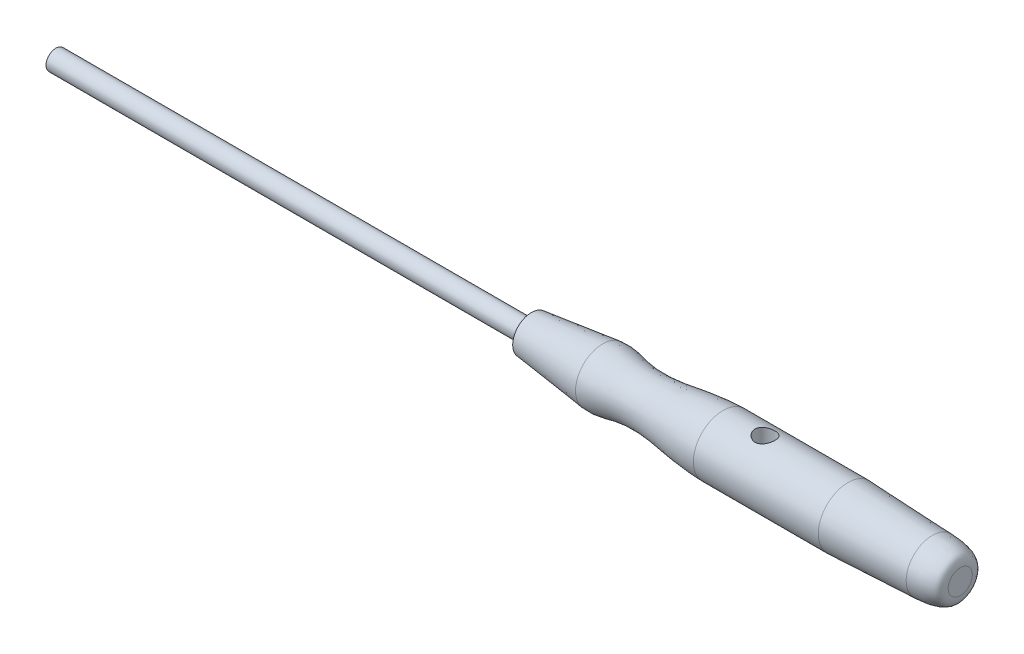
ISO-10303-21;
HEADER;
FILE_DESCRIPTION(('STEP AP214'),'2;1');
FILE_NAME('part.step','',(''),(''),'','','');
FILE_SCHEMA(('AUTOMOTIVE_DESIGN { 1 0 10303 214 1 1 1 1 }'));
ENDSEC;
DATA;
#1=APPLICATION_CONTEXT('core data for automotive mechanical design processes');
#2=APPLICATION_PROTOCOL_DEFINITION('international standard','automotive_design',2000,#1);
#3=PRODUCT_CONTEXT('',#1,'mechanical');
#4=PRODUCT('Part','Part','',(#3));
#5=PRODUCT_RELATED_PRODUCT_CATEGORY('part','',(#4));
#6=PRODUCT_DEFINITION_FORMATION('','',#4);
#7=PRODUCT_DEFINITION_CONTEXT('part definition',#1,'design');
#8=PRODUCT_DEFINITION('design','',#6,#7);
#9=PRODUCT_DEFINITION_SHAPE('','',#8);
#10=(LENGTH_UNIT() NAMED_UNIT(*) SI_UNIT(.MILLI.,.METRE.));
#11=(NAMED_UNIT(*) PLANE_ANGLE_UNIT() SI_UNIT($,.RADIAN.));
#12=(NAMED_UNIT(*) SI_UNIT($,.STERADIAN.) SOLID_ANGLE_UNIT());
#13=UNCERTAINTY_MEASURE_WITH_UNIT(LENGTH_MEASURE(1.E-05),#10,'distance_accuracy_value','');
#14=(GEOMETRIC_REPRESENTATION_CONTEXT(3) GLOBAL_UNCERTAINTY_ASSIGNED_CONTEXT((#13)) GLOBAL_UNIT_ASSIGNED_CONTEXT((#10,
#11,#12)) REPRESENTATION_CONTEXT('',''));
#15=CARTESIAN_POINT('',(0.,0.,0.));
#16=DIRECTION('',(0.,0.,1.));
#17=DIRECTION('',(1.,0.,0.));
#18=AXIS2_PLACEMENT_3D('',#15,#16,#17);
#19=CARTESIAN_POINT('',(-137.5,0.,0.));
#20=DIRECTION('',(-1.,0.,0.));
#21=DIRECTION('',(0.,-1.,0.));
#22=AXIS2_PLACEMENT_3D('',#19,#20,#21);
#23=CYLINDRICAL_SURFACE('',#22,19.05);
#24=CARTESIAN_POINT('',(-14.564,0.,0.));
#25=DIRECTION('',(-1.,0.,0.));
#26=DIRECTION('',(0.,-1.,0.));
#27=AXIS2_PLACEMENT_3D('',#24,#25,#26);
#28=CIRCLE('',#27,19.05);
#29=CARTESIAN_POINT('',(-14.564,-19.0499999999999,0.));
#30=VERTEX_POINT('',#29);
#31=EDGE_CURVE('E129',#30,#30,#28,.T.);
#32=ORIENTED_EDGE('',*,*,#31,.F.);
#33=EDGE_LOOP('',(#32));
#34=FACE_BOUND('',#33,.T.);
#35=CARTESIAN_POINT('',(65.5,0.,0.));
#36=DIRECTION('',(-1.,0.,0.));
#37=DIRECTION('',(0.,-1.,0.));
#38=AXIS2_PLACEMENT_3D('',#35,#36,#37);
#39=CIRCLE('',#38,19.05);
#40=CARTESIAN_POINT('',(65.5,-19.0499999999999,0.));
#41=VERTEX_POINT('',#40);
#42=EDGE_CURVE('E132',#41,#41,#39,.T.);
#43=ORIENTED_EDGE('',*,*,#42,.T.);
#44=EDGE_LOOP('',(#43));
#45=FACE_BOUND('',#44,.T.);
#46=CARTESIAN_POINT('',(12.36,17.9605122421383,-6.35));
#47=CARTESIAN_POINT('',(12.5329048893612,17.9605121841743,-6.35000007467187));
#48=CARTESIAN_POINT('',(12.7058086993195,17.9630158170993,-6.34293207443151));
#49=CARTESIAN_POINT('',(13.0503843538287,17.9729507908354,-6.31472584323583));
#50=CARTESIAN_POINT('',(13.2220557255694,17.9803839303172,-6.29358247647192));
#51=CARTESIAN_POINT('',(13.5627977784464,17.9999387474085,-6.23743424237858));
#52=CARTESIAN_POINT('',(13.7318690890143,18.0120592710937,-6.20243278653587));
#53=CARTESIAN_POINT('',(14.0663229836838,18.0406142280405,-6.11887938259321));
#54=CARTESIAN_POINT('',(14.2317040989144,18.0570503470113,-6.07032213901403));
#55=CARTESIAN_POINT('',(14.5572047901502,18.0936898864177,-5.9602215150775));
#56=CARTESIAN_POINT('',(14.7173359800168,18.1138842233465,-5.89870940004715));
#57=CARTESIAN_POINT('',(15.0317916435437,18.1574836120493,-5.76310329571688));
#58=CARTESIAN_POINT('',(15.186113936605,18.1808898545199,-5.68900463798159));
#59=CARTESIAN_POINT('',(15.4879320456376,18.2302439315275,-5.52880871589195));
#60=CARTESIAN_POINT('',(15.6354291340736,18.2561912894746,-5.44271370019568));
#61=CARTESIAN_POINT('',(15.9228285658147,18.3099374140938,-5.25907267568229));
#62=CARTESIAN_POINT('',(16.0627281535657,18.3377368444647,-5.16152255221946));
#63=CARTESIAN_POINT('',(16.3388924543855,18.3954535011269,-4.9519704663745));
#64=CARTESIAN_POINT('',(16.4748537151547,18.4254108542597,-4.83957945535955));
#65=CARTESIAN_POINT('',(16.7369169809071,18.4857008813243,-4.60392786160509));
#66=CARTESIAN_POINT('',(16.86301879383,18.5160335625541,-4.48066706722364));
#67=CARTESIAN_POINT('',(17.1046289023187,18.5762700584007,-4.22398755491756));
#68=CARTESIAN_POINT('',(17.2201336501056,18.6061737265825,-4.09056546226525));
#69=CARTESIAN_POINT('',(17.4397204364232,18.6647358311806,-3.81445197871254));
#70=CARTESIAN_POINT('',(17.5438064424056,18.6933946980002,-3.67176383491661));
#71=CARTESIAN_POINT('',(17.742496600939,18.7494517961145,-3.3740336259551));
#72=CARTESIAN_POINT('',(17.8367755240712,18.776796334375,-3.21876410858282));
#73=CARTESIAN_POINT('',(18.0118252185834,18.828598949967,-2.90040622051583));
#74=CARTESIAN_POINT('',(18.0926013189444,18.853058164884,-2.73732096720631));
#75=CARTESIAN_POINT('',(18.2400258776401,18.8984068456182,-2.40436062510117));
#76=CARTESIAN_POINT('',(18.3066714481517,18.9192955815763,-2.23448415681591));
#77=CARTESIAN_POINT('',(18.4251801326333,18.9568787025541,-1.88927888325925));
#78=CARTESIAN_POINT('',(18.4770498876315,18.9735749714878,-1.71395256686032));
#79=CARTESIAN_POINT('',(18.5640178166869,19.0017947733666,-1.36522428846162));
#80=CARTESIAN_POINT('',(18.5996316094182,19.01347650807,-1.19196364650285));
#81=CARTESIAN_POINT('',(18.656290767647,19.0321454456513,-0.842895111101326));
#82=CARTESIAN_POINT('',(18.6773421163871,19.0391345765353,-0.667088294148715));
#83=CARTESIAN_POINT('',(18.7046899160807,19.0482262560928,-0.314209218879316));
#84=CARTESIAN_POINT('',(18.7109867609576,19.0503289352273,-0.137136994473646));
#85=CARTESIAN_POINT('',(18.7087627466738,19.049587568049,0.216901921002763));
#86=CARTESIAN_POINT('',(18.7002422305748,19.0467436362635,0.393868614421933));
#87=CARTESIAN_POINT('',(18.669098834915,19.036399993617,0.739365284519381));
#88=CARTESIAN_POINT('',(18.6470456785782,19.0290884203769,0.907952629393989));
#89=CARTESIAN_POINT('',(18.5895414290879,19.0101669985195,1.24263965626492));
#90=CARTESIAN_POINT('',(18.5540858063356,18.9985556967605,1.40873847746823));
#91=CARTESIAN_POINT('',(18.4701030565091,18.9713411108767,1.73720119624074));
#92=CARTESIAN_POINT('',(18.4215801834594,18.9557391259958,1.89956629068116));
#93=CARTESIAN_POINT('',(18.3118429721928,18.9209335884611,2.21961616319675));
#94=CARTESIAN_POINT('',(18.2506238452836,18.9017286771399,2.37729914957653));
#95=CARTESIAN_POINT('',(18.1151258842597,18.8599382105028,2.68891421853453));
#96=CARTESIAN_POINT('',(18.0406903922671,18.8373126491989,2.8427727771282));
#97=CARTESIAN_POINT('',(17.8798366047179,18.7894305663877,3.14372828729916));
#98=CARTESIAN_POINT('',(17.7934142086573,18.7641731453071,3.29082290202758));
#99=CARTESIAN_POINT('',(17.6092010479193,18.7116626522826,3.57734506918722));
#100=CARTESIAN_POINT('',(17.5114096459081,18.6844094684901,3.71677219114134));
#101=CARTESIAN_POINT('',(17.3050923455741,18.6285822698494,3.98716495399287));
#102=CARTESIAN_POINT('',(17.1965660566329,18.6000082069575,4.11813028669789));
#103=CARTESIAN_POINT('',(16.9640616572674,18.5408779551479,4.37684545048268));
#104=CARTESIAN_POINT('',(16.8395955104998,18.5102919359601,4.50415027127115));
#105=CARTESIAN_POINT('',(16.5804397296168,18.4492888676298,4.74784339620421));
#106=CARTESIAN_POINT('',(16.4457533108898,18.4188717685491,4.86423510815807));
#107=CARTESIAN_POINT('',(16.1668732938627,18.3590231511138,5.08546063018026));
#108=CARTESIAN_POINT('',(16.0226747287521,18.3295921599489,5.19028832447545));
#109=CARTESIAN_POINT('',(15.72577596231,18.2725815338622,5.38756027003843));
#110=CARTESIAN_POINT('',(15.5730791107501,18.2450011787983,5.480009352328));
#111=CARTESIAN_POINT('',(15.2577787513559,18.1921032459389,5.65315834756608));
#112=CARTESIAN_POINT('',(15.0950624597289,18.1668249772563,5.73366516353339));
#113=CARTESIAN_POINT('',(14.7629640367406,18.1198022602484,5.88057969904579));
#114=CARTESIAN_POINT('',(14.5935845355197,18.0980564346221,5.94699291679969));
#115=CARTESIAN_POINT('',(14.2493279189632,18.058801934227,6.06515064268838));
#116=CARTESIAN_POINT('',(14.0744515836549,18.0412926613106,6.1168972217438));
#117=CARTESIAN_POINT('',(13.7205023634224,18.0111045097315,6.20522346520949));
#118=CARTESIAN_POINT('',(13.5414296954307,17.9984253819528,6.24180391182512));
#119=CARTESIAN_POINT('',(13.1886577023196,17.9787949890032,6.29811699796801));
#120=CARTESIAN_POINT('',(13.015080565666,17.971611063163,6.31853543370886));
#121=CARTESIAN_POINT('',(12.6667009613968,17.9622869124369,6.34499394377563));
#122=CARTESIAN_POINT('',(12.4918985372033,17.9601465097146,6.35103452507011));
#123=CARTESIAN_POINT('',(12.1424325037919,17.9609801314463,6.34867652793738));
#124=CARTESIAN_POINT('',(11.9677688768581,17.9639533388488,6.34028025622768));
#125=CARTESIAN_POINT('',(11.6198868596507,17.9749142495206,6.309138563187));
#126=CARTESIAN_POINT('',(11.4466684516347,17.9829018911375,6.28639331827606));
#127=CARTESIAN_POINT('',(11.1089237860065,18.0032708197849,6.22781361622577));
#128=CARTESIAN_POINT('',(10.9443041443268,18.0154905329272,6.19245924965254));
#129=CARTESIAN_POINT('',(10.6186672221139,18.0439996158971,6.10888905897269));
#130=CARTESIAN_POINT('',(10.4576511538251,18.0602903334414,6.06066897527755));
#131=CARTESIAN_POINT('',(10.1403442530326,18.0964645265794,5.95178614996644));
#132=CARTESIAN_POINT('',(9.9840523706642,18.1163471969716,5.89112619656182));
#133=CARTESIAN_POINT('',(9.67704386351722,18.1591611703442,5.75780047904466));
#134=CARTESIAN_POINT('',(9.52632938354142,18.1820936308712,5.68513015384566));
#135=CARTESIAN_POINT('',(9.22677607737642,18.2311431035954,5.52585539435068));
#136=CARTESIAN_POINT('',(9.07814421393858,18.257337418412,5.4388855184361));
#137=CARTESIAN_POINT('',(8.78861963569909,18.3115953760894,5.25331510969612));
#138=CARTESIAN_POINT('',(8.64772961588815,18.3396596624723,5.15471056388415));
#139=CARTESIAN_POINT('',(8.37453406252708,18.3969044730028,4.9465198326357));
#140=CARTESIAN_POINT('',(8.24222930474783,18.4260850976459,4.83693265707056));
#141=CARTESIAN_POINT('',(7.98697045700054,18.4848033864811,4.60744722274103));
#142=CARTESIAN_POINT('',(7.86401658404977,18.5143410589412,4.48754872480687));
#143=CARTESIAN_POINT('',(7.62246831380917,18.5744412121883,4.23209963560971));
#144=CARTESIAN_POINT('',(7.50437239621551,18.6049841614765,4.09607248840989));
#145=CARTESIAN_POINT('',(7.28007578377248,18.664778246815,3.81435164909172));
#146=CARTESIAN_POINT('',(7.17387112411002,18.6940298114599,3.66866120488881));
#147=CARTESIAN_POINT('',(6.97402901818268,18.7504530318865,3.3684336930749));
#148=CARTESIAN_POINT('',(6.88039635203512,18.7776238948672,3.21389329221657));
#149=CARTESIAN_POINT('',(6.70650426640412,18.8291029215125,2.89708847566713));
#150=CARTESIAN_POINT('',(6.62623923996242,18.8534122841516,2.73482733528804));
#151=CARTESIAN_POINT('',(6.48015853214839,18.8983526620096,2.40465168177921));
#152=CARTESIAN_POINT('',(6.41425641078046,18.9190055333313,2.23677842238123));
#153=CARTESIAN_POINT('',(6.29688441019861,18.9562198624823,1.89569072154763));
#154=CARTESIAN_POINT('',(6.24540867351838,18.9727829805258,1.72247847967073));
#155=CARTESIAN_POINT('',(6.15734792817547,19.0013461729396,1.37195443604879));
#156=CARTESIAN_POINT('',(6.12076150306406,19.0133466813523,1.19464302596226));
#157=CARTESIAN_POINT('',(6.06284105210709,19.0324318084485,0.837286870863789));
#158=CARTESIAN_POINT('',(6.04150636962456,19.0395166387673,0.657242243866559));
#159=CARTESIAN_POINT('',(6.0149507937708,19.0483464738216,0.304399939069057));
#160=CARTESIAN_POINT('',(6.00901662773618,19.050327811339,0.131661476409807));
#161=CARTESIAN_POINT('',(6.01124883539023,19.049583701765,-0.21377539227599));
#162=CARTESIAN_POINT('',(6.01942001187633,19.0468566514914,-0.386473764626123));
#163=CARTESIAN_POINT('',(6.04978713971672,19.036769222305,-0.730414910159583));
#164=CARTESIAN_POINT('',(6.07197673003419,19.0294109448771,-0.90165830785822));
#165=CARTESIAN_POINT('',(6.1301769110018,19.010258841641,-1.24159215291774));
#166=CARTESIAN_POINT('',(6.16619266298495,18.9984633594488,-1.41028162241909));
#167=CARTESIAN_POINT('',(6.25101904977245,18.9709796061496,-1.74113205541997));
#168=CARTESIAN_POINT('',(6.29961147550841,18.9553579469971,-1.90335462060486));
#169=CARTESIAN_POINT('',(6.40946667760174,18.920521496432,-2.22311558916087));
#170=CARTESIAN_POINT('',(6.47073396730047,18.9013054253338,-2.38065230104733));
#171=CARTESIAN_POINT('',(6.60543358155544,18.8597702235758,-2.68996559538903));
#172=CARTESIAN_POINT('',(6.67886325404243,18.8374517695764,-2.84174342474925));
#173=CARTESIAN_POINT('',(6.8373888061244,18.7902503646299,-3.13872746855851));
#174=CARTESIAN_POINT('',(6.9224888671748,18.7653664953012,-3.28393130265417));
#175=CARTESIAN_POINT('',(7.10709571414095,18.7126933760356,-3.57209205622814));
#176=CARTESIAN_POINT('',(7.20701719248428,18.6848309370529,-3.71477001212558));
#177=CARTESIAN_POINT('',(7.41808742629958,18.6277261015556,-3.99127224330518));
#178=CARTESIAN_POINT('',(7.52923657499846,18.5984836567283,-4.12509620822201));
#179=CARTESIAN_POINT('',(7.76210974791763,18.5393610594388,-4.38316388676336));
#180=CARTESIAN_POINT('',(7.88383853090085,18.5094806246121,-4.50740324126623));
#181=CARTESIAN_POINT('',(8.13705111119739,18.4498824788936,-4.74546004441081));
#182=CARTESIAN_POINT('',(8.26853175258196,18.4201647186707,-4.85928083833075));
#183=CARTESIAN_POINT('',(8.5459046797865,18.3605083051536,-5.0801412712014));
#184=CARTESIAN_POINT('',(8.69216146794026,18.3306074981088,-5.18673395080548));
#185=CARTESIAN_POINT('',(8.9934458815642,18.2727076517125,-5.38716410257997));
#186=CARTESIAN_POINT('',(9.14847020652462,18.2447079053334,-5.4810063299439));
#187=CARTESIAN_POINT('',(9.4663733732635,18.191440834821,-5.65528861435427));
#188=CARTESIAN_POINT('',(9.62925378111994,18.1661740587765,-5.73572598484048));
#189=CARTESIAN_POINT('',(9.96167102085719,18.119186796233,-5.88247472021432));
#190=CARTESIAN_POINT('',(10.1312048076611,18.09746471037,-5.9487924600178));
#191=CARTESIAN_POINT('',(10.4680578405731,18.0591448851981,-6.06410020462713));
#192=CARTESIAN_POINT('',(10.635135783141,18.042361110104,-6.11373361228482));
#193=CARTESIAN_POINT('',(10.973106231664,18.0131937705727,-6.19914429051323));
#194=CARTESIAN_POINT('',(11.1439971338891,18.0008083919142,-6.2349272745633));
#195=CARTESIAN_POINT('',(11.4884038572939,17.9808267796658,-6.29232024349929));
#196=CARTESIAN_POINT('',(11.6619194062581,17.9732300528606,-6.3139316880161));
#197=CARTESIAN_POINT('',(12.01029034166,17.9630728234143,-6.34277149992564));
#198=CARTESIAN_POINT('',(12.1851457227696,17.9605123007558,-6.34999992448626));
#199=CARTESIAN_POINT('',(12.36,17.9605122421383,-6.35));
#200=B_SPLINE_CURVE_WITH_KNOTS('',3,(#46,#47,#48,#49,#50,#51,#52,#53,#54,#55,#56,#57,#58,#59,
#60,#61,#62,#63,#64,#65,#66,#67,#68,#69,#70,#71,#72,#73,#74,#75,#76,#77,#78,#79,#80,#81,#82,#83,
#84,#85,#86,#87,#88,#89,#90,#91,#92,#93,#94,#95,#96,#97,#98,#99,#100,#101,#102,#103,#104,#105,
#106,#107,#108,#109,#110,#111,#112,#113,#114,#115,#116,#117,#118,#119,#120,#121,#122,#123,#124,
#125,#126,#127,#128,#129,#130,#131,#132,#133,#134,#135,#136,#137,#138,#139,#140,#141,#142,#143,
#144,#145,#146,#147,#148,#149,#150,#151,#152,#153,#154,#155,#156,#157,#158,#159,#160,#161,#162,
#163,#164,#165,#166,#167,#168,#169,#170,#171,#172,#173,#174,#175,#176,#177,#178,#179,#180,#181,
#182,#183,#184,#185,#186,#187,#188,#189,#190,#191,#192,#193,#194,#195,#196,#197,#198,#199),
.UNSPECIFIED.,.T.,.F.,(4,2,2,2,2,2,2,2,2,2,2,2,2,2,2,2,2,2,2,2,2,2,2,2,2,2,2,2,2,2,2,2,2,2,2,2,
2,2,2,2,2,2,2,2,2,2,2,2,2,2,2,2,2,2,2,2,2,2,2,2,2,2,2,2,2,2,2,2,2,2,2,2,2,2,2,2,4),(0.,
0.518551190720206,1.03729169377054,1.55590457625912,2.07472033562746,2.592298044827,
3.11006814803522,3.62774132802884,4.14560102700588,4.68177234198808,5.21795409889,
5.75431471335886,6.2904883746662,6.84090158058548,7.39109704669767,7.94140484680646,
8.49146491800034,9.02260055284767,9.5535178312266,10.084420934737,10.6153117465768,
11.1252544428486,11.635369637518,12.145318965252,12.6554609833795,13.1721116844525,
13.6889395603306,14.2057964229859,14.7226720998249,15.2639930028963,15.805144302114,
16.3465804375137,16.8878046459563,17.4370000687288,17.9859808433419,18.5348840635372,
19.0837589700889,19.6078648257983,20.1319522010648,20.6559558455359,21.1799530475291,
21.6858208709719,22.1918563856786,22.6977786037881,23.2038933954328,23.7258764687289,
24.2480401116692,24.7702508722021,25.2924737486133,25.8399546814312,26.387252524741,
26.934757875636,27.482032997888,28.0259174775812,28.5695808058328,29.113192402254,
29.6567805930241,30.1747024737475,30.6928007390254,31.2106640791972,31.728720927042,
32.2383303533507,32.7481215577426,33.2578017455692,33.7676650293052,34.2962769393839,
34.8249073694708,35.3537768226458,35.8824758619217,36.4321092541269,36.9815370983736,
37.5310749251787,38.0803641108162,38.605034396734,39.1294880181041,39.6538876136575,
40.1782851248866),.UNSPECIFIED.);
#201=CARTESIAN_POINT('',(12.36,17.9605122421383,-6.35));
#202=VERTEX_POINT('',#201);
#203=EDGE_CURVE('E63',#202,#202,#200,.T.);
#204=ORIENTED_EDGE('',*,*,#203,.T.);
#205=EDGE_LOOP('',(#204));
#206=FACE_BOUND('',#205,.T.);
#207=ADVANCED_FACE('F43',(#34,#45,#206),#23,.T.);
#208=CARTESIAN_POINT('',(-91.78,0.,0.));
#209=DIRECTION('',(1.,0.,0.));
#210=DIRECTION('',(0.,1.,0.));
#211=AXIS2_PLACEMENT_3D('',#208,#209,#210);
#212=CONICAL_SURFACE('',#211,17.399,0.11888122095754);
#213=CARTESIAN_POINT('',(-137.5,0.,0.));
#214=DIRECTION('',(-1.,0.,0.));
#215=DIRECTION('',(0.,-1.,0.));
#216=AXIS2_PLACEMENT_3D('',#213,#214,#215);
#217=CIRCLE('',#216,11.938);
#218=CARTESIAN_POINT('',(-137.5,-11.938,0.));
#219=VERTEX_POINT('',#218);
#220=EDGE_CURVE('E47',#219,#219,#217,.T.);
#221=ORIENTED_EDGE('',*,*,#220,.F.);
#222=EDGE_LOOP('',(#221));
#223=FACE_BOUND('',#222,.T.);
#224=CARTESIAN_POINT('',(-91.78,0.,0.));
#225=DIRECTION('',(-1.,0.,0.));
#226=DIRECTION('',(0.,-1.,0.));
#227=AXIS2_PLACEMENT_3D('',#224,#225,#226);
#228=CIRCLE('',#227,17.399);
#229=CARTESIAN_POINT('',(-91.78,-17.399,0.));
#230=VERTEX_POINT('',#229);
#231=EDGE_CURVE('E62',#230,#230,#228,.T.);
#232=ORIENTED_EDGE('',*,*,#231,.T.);
#233=EDGE_LOOP('',(#232));
#234=FACE_BOUND('',#233,.T.);
#235=ADVANCED_FACE('F45',(#223,#234),#212,.T.);
#236=CARTESIAN_POINT('',(-137.5,11.938,0.));
#237=DIRECTION('',(1.,0.,0.));
#238=DIRECTION('',(0.,1.,0.));
#239=AXIS2_PLACEMENT_3D('',#236,#237,#238);
#240=PLANE('',#239);
#241=CARTESIAN_POINT('',(-137.5,0.,0.));
#242=DIRECTION('',(-1.,0.,0.));
#243=DIRECTION('',(0.,-1.,0.));
#244=AXIS2_PLACEMENT_3D('',#241,#242,#243);
#245=CIRCLE('',#244,6.35);
#246=CARTESIAN_POINT('',(-137.5,6.34999999999997,0.));
#247=VERTEX_POINT('',#246);
#248=EDGE_CURVE('E10',#247,#247,#245,.T.);
#249=ORIENTED_EDGE('',*,*,#248,.F.);
#250=EDGE_LOOP('',(#249));
#251=FACE_BOUND('',#250,.T.);
#252=ORIENTED_EDGE('',*,*,#220,.T.);
#253=EDGE_LOOP('',(#252));
#254=FACE_BOUND('',#253,.T.);
#255=ADVANCED_FACE('F102',(#251,#254),#240,.F.);
#256=CARTESIAN_POINT('',(137.5,7.74700000000005,0.));
#257=DIRECTION('',(-1.,0.,0.));
#258=DIRECTION('',(0.,-1.,0.));
#259=AXIS2_PLACEMENT_3D('',#256,#257,#258);
#260=PLANE('',#259);
#261=CARTESIAN_POINT('',(137.5,0.,0.));
#262=DIRECTION('',(-1.,0.,0.));
#263=DIRECTION('',(0.,-1.,0.));
#264=AXIS2_PLACEMENT_3D('',#261,#262,#263);
#265=CIRCLE('',#264,7.747);
#266=CARTESIAN_POINT('',(137.5,-7.74699999999995,0.));
#267=VERTEX_POINT('',#266);
#268=EDGE_CURVE('E55',#267,#267,#265,.T.);
#269=ORIENTED_EDGE('',*,*,#268,.F.);
#270=EDGE_LOOP('',(#269));
#271=FACE_BOUND('',#270,.T.);
#272=ADVANCED_FACE('F114',(#271),#260,.F.);
#273=CARTESIAN_POINT('',(137.5,7.74700000000005,0.));
#274=CARTESIAN_POINT('',(137.5,12.322795174278,0.));
#275=CARTESIAN_POINT('',(132.251729161469,15.7307599018356,0.));
#276=CARTESIAN_POINT('',(126.446685513367,16.4747879360549,0.));
#277=CARTESIAN_POINT('',(119.602,16.764,0.));
#278=B_SPLINE_CURVE_WITH_KNOTS('',3,(#273,#274,#275,#276,#277),.UNSPECIFIED.,.F.,.F.,(4,1,4),
(0.,0.343752138132964,1.),.UNSPECIFIED.);
#279=CARTESIAN_POINT('',(-137.5,0.,0.));
#280=DIRECTION('',(-1.,0.,0.));
#281=AXIS1_PLACEMENT('',#279,#280);
#282=SURFACE_OF_REVOLUTION('',#278,#281);
#283=CARTESIAN_POINT('',(119.602,0.,0.));
#284=DIRECTION('',(-1.,0.,0.));
#285=DIRECTION('',(0.,-1.,0.));
#286=AXIS2_PLACEMENT_3D('',#283,#284,#285);
#287=CIRCLE('',#286,16.764);
#288=CARTESIAN_POINT('',(119.602,-16.7639999999999,0.));
#289=VERTEX_POINT('',#288);
#290=EDGE_CURVE('E140',#289,#289,#287,.T.);
#291=ORIENTED_EDGE('',*,*,#290,.F.);
#292=EDGE_LOOP('',(#291));
#293=FACE_BOUND('',#292,.T.);
#294=ORIENTED_EDGE('',*,*,#268,.T.);
#295=EDGE_LOOP('',(#294));
#296=FACE_BOUND('',#295,.T.);
#297=ADVANCED_FACE('F110',(#293,#296),#282,.T.);
#298=CARTESIAN_POINT('',(119.602,0.,0.));
#299=DIRECTION('',(-1.,0.,0.));
#300=DIRECTION('',(0.,-1.,0.));
#301=AXIS2_PLACEMENT_3D('',#298,#299,#300);
#302=CONICAL_SURFACE('',#301,16.764,0.042228402113002);
#303=ORIENTED_EDGE('',*,*,#42,.F.);
#304=EDGE_LOOP('',(#303));
#305=FACE_BOUND('',#304,.T.);
#306=ORIENTED_EDGE('',*,*,#290,.T.);
#307=EDGE_LOOP('',(#306));
#308=FACE_BOUND('',#307,.T.);
#309=ADVANCED_FACE('F107',(#305,#308),#302,.T.);
#310=CARTESIAN_POINT('',(-14.564,19.05,0.));
#311=CARTESIAN_POINT('',(-35.8294470897163,19.05,0.));
#312=CARTESIAN_POINT('',(-60.549292723355,10.0128053188379,0.));
#313=CARTESIAN_POINT('',(-84.9013365409294,18.220618135389,0.));
#314=CARTESIAN_POINT('',(-91.78,17.399,0.));
#315=B_SPLINE_CURVE_WITH_KNOTS('',3,(#310,#311,#312,#313,#314),.UNSPECIFIED.,.F.,.F.,(4,1,4),
(0.,0.755761848674318,1.),.UNSPECIFIED.);
#316=CARTESIAN_POINT('',(-137.5,0.,0.));
#317=DIRECTION('',(-1.,0.,0.));
#318=AXIS1_PLACEMENT('',#316,#317);
#319=SURFACE_OF_REVOLUTION('',#315,#318);
#320=ORIENTED_EDGE('',*,*,#231,.F.);
#321=EDGE_LOOP('',(#320));
#322=FACE_BOUND('',#321,.T.);
#323=ORIENTED_EDGE('',*,*,#31,.T.);
#324=EDGE_LOOP('',(#323));
#325=FACE_BOUND('',#324,.T.);
#326=ADVANCED_FACE('F92',(#322,#325),#319,.T.);
#327=CARTESIAN_POINT('',(12.36,19.051,0.));
#328=DIRECTION('',(0.,-1.,0.));
#329=DIRECTION('',(0.,0.,-1.));
#330=AXIS2_PLACEMENT_3D('',#327,#328,#329);
#331=CYLINDRICAL_SURFACE('',#330,6.35);
#332=CARTESIAN_POINT('',(12.36,0.,0.));
#333=DIRECTION('',(0.,1.,0.));
#334=DIRECTION('',(0.,0.,1.));
#335=AXIS2_PLACEMENT_3D('',#332,#333,#334);
#336=CIRCLE('',#335,6.35);
#337=CARTESIAN_POINT('',(12.36,0.,6.35));
#338=VERTEX_POINT('',#337);
#339=EDGE_CURVE('E59',#338,#338,#336,.T.);
#340=ORIENTED_EDGE('',*,*,#339,.F.);
#341=EDGE_LOOP('',(#340));
#342=FACE_BOUND('',#341,.T.);
#343=ORIENTED_EDGE('',*,*,#203,.F.);
#344=EDGE_LOOP('',(#343));
#345=FACE_BOUND('',#344,.T.);
#346=ADVANCED_FACE('F75',(#342,#345),#331,.F.);
#347=CARTESIAN_POINT('',(12.36,0.,0.));
#348=DIRECTION('',(0.,1.,0.));
#349=DIRECTION('',(0.,0.,1.));
#350=AXIS2_PLACEMENT_3D('',#347,#348,#349);
#351=PLANE('',#350);
#352=ORIENTED_EDGE('',*,*,#339,.T.);
#353=EDGE_LOOP('',(#352));
#354=FACE_BOUND('',#353,.T.);
#355=ADVANCED_FACE('F83',(#354),#351,.T.);
#356=CARTESIAN_POINT('',(-442.3,0.,0.));
#357=DIRECTION('',(1.,0.,0.));
#358=DIRECTION('',(0.,1.,0.));
#359=AXIS2_PLACEMENT_3D('',#356,#357,#358);
#360=CYLINDRICAL_SURFACE('',#359,6.35);
#361=CARTESIAN_POINT('',(-442.3,0.,0.));
#362=DIRECTION('',(-1.,0.,0.));
#363=DIRECTION('',(0.,-1.,0.));
#364=AXIS2_PLACEMENT_3D('',#361,#362,#363);
#365=CIRCLE('',#364,6.35);
#366=CARTESIAN_POINT('',(-442.3,6.34999999999992,0.));
#367=VERTEX_POINT('',#366);
#368=EDGE_CURVE('E58',#367,#367,#365,.T.);
#369=CARTESIAN_POINT('',(-442.3,6.34999999999992,0.));
#370=CARTESIAN_POINT('',(-439.125,6.34999999999992,0.));
#371=CARTESIAN_POINT('',(-435.95,6.34999999999992,0.));
#372=CARTESIAN_POINT('',(-429.6,6.34999999999992,0.));
#373=CARTESIAN_POINT('',(-426.425,6.34999999999992,0.));
#374=CARTESIAN_POINT('',(-420.075,6.34999999999992,0.));
#375=CARTESIAN_POINT('',(-416.9,6.34999999999992,0.));
#376=CARTESIAN_POINT('',(-410.55,6.34999999999992,0.));
#377=CARTESIAN_POINT('',(-407.375,6.34999999999992,0.));
#378=CARTESIAN_POINT('',(-401.025,6.34999999999993,0.));
#379=CARTESIAN_POINT('',(-397.85,6.34999999999993,0.));
#380=CARTESIAN_POINT('',(-391.5,6.34999999999993,0.));
#381=CARTESIAN_POINT('',(-388.325,6.34999999999993,0.));
#382=CARTESIAN_POINT('',(-381.975,6.34999999999993,0.));
#383=CARTESIAN_POINT('',(-378.8,6.34999999999993,0.));
#384=CARTESIAN_POINT('',(-372.45,6.34999999999993,0.));
#385=CARTESIAN_POINT('',(-369.275,6.34999999999993,0.));
#386=CARTESIAN_POINT('',(-362.925,6.34999999999993,0.));
#387=CARTESIAN_POINT('',(-359.75,6.34999999999993,0.));
#388=CARTESIAN_POINT('',(-353.4,6.34999999999993,0.));
#389=CARTESIAN_POINT('',(-350.225,6.34999999999993,0.));
#390=CARTESIAN_POINT('',(-343.875,6.34999999999994,0.));
#391=CARTESIAN_POINT('',(-340.7,6.34999999999994,0.));
#392=CARTESIAN_POINT('',(-334.35,6.34999999999994,0.));
#393=CARTESIAN_POINT('',(-331.175,6.34999999999994,0.));
#394=CARTESIAN_POINT('',(-324.825,6.34999999999994,0.));
#395=CARTESIAN_POINT('',(-321.65,6.34999999999994,0.));
#396=CARTESIAN_POINT('',(-315.3,6.34999999999994,0.));
#397=CARTESIAN_POINT('',(-312.125,6.34999999999994,0.));
#398=CARTESIAN_POINT('',(-305.775,6.34999999999994,0.));
#399=CARTESIAN_POINT('',(-302.6,6.34999999999994,0.));
#400=CARTESIAN_POINT('',(-296.25,6.34999999999995,0.));
#401=CARTESIAN_POINT('',(-293.075,6.34999999999995,0.));
#402=CARTESIAN_POINT('',(-286.725,6.34999999999995,0.));
#403=CARTESIAN_POINT('',(-283.55,6.34999999999995,0.));
#404=CARTESIAN_POINT('',(-277.2,6.34999999999995,0.));
#405=CARTESIAN_POINT('',(-274.025,6.34999999999995,0.));
#406=CARTESIAN_POINT('',(-267.675,6.34999999999995,0.));
#407=CARTESIAN_POINT('',(-264.5,6.34999999999995,0.));
#408=CARTESIAN_POINT('',(-258.15,6.34999999999995,0.));
#409=CARTESIAN_POINT('',(-254.975,6.34999999999995,0.));
#410=CARTESIAN_POINT('',(-248.625,6.34999999999995,0.));
#411=CARTESIAN_POINT('',(-245.45,6.34999999999995,0.));
#412=CARTESIAN_POINT('',(-239.1,6.34999999999996,0.));
#413=CARTESIAN_POINT('',(-235.925,6.34999999999996,0.));
#414=CARTESIAN_POINT('',(-229.575,6.34999999999996,0.));
#415=CARTESIAN_POINT('',(-226.4,6.34999999999996,0.));
#416=CARTESIAN_POINT('',(-220.05,6.34999999999996,0.));
#417=CARTESIAN_POINT('',(-216.875,6.34999999999996,0.));
#418=CARTESIAN_POINT('',(-210.525,6.34999999999996,0.));
#419=CARTESIAN_POINT('',(-207.35,6.34999999999996,0.));
#420=CARTESIAN_POINT('',(-201.,6.34999999999996,0.));
#421=CARTESIAN_POINT('',(-197.825,6.34999999999996,0.));
#422=CARTESIAN_POINT('',(-191.475,6.34999999999996,0.));
#423=CARTESIAN_POINT('',(-188.3,6.34999999999996,0.));
#424=CARTESIAN_POINT('',(-181.95,6.34999999999997,0.));
#425=CARTESIAN_POINT('',(-178.775,6.34999999999997,0.));
#426=CARTESIAN_POINT('',(-172.425,6.34999999999997,0.));
#427=CARTESIAN_POINT('',(-169.25,6.34999999999997,0.));
#428=CARTESIAN_POINT('',(-162.9,6.34999999999997,0.));
#429=CARTESIAN_POINT('',(-159.725,6.34999999999997,0.));
#430=CARTESIAN_POINT('',(-153.375,6.34999999999997,0.));
#431=CARTESIAN_POINT('',(-150.2,6.34999999999997,0.));
#432=CARTESIAN_POINT('',(-143.85,6.34999999999997,0.));
#433=CARTESIAN_POINT('',(-140.675,6.34999999999997,0.));
#434=CARTESIAN_POINT('',(-137.5,6.34999999999997,0.));
#435=B_SPLINE_CURVE_WITH_KNOTS('',3,(#369,#370,#371,#372,#373,#374,#375,#376,#377,#378,#379,
#380,#381,#382,#383,#384,#385,#386,#387,#388,#389,#390,#391,#392,#393,#394,#395,#396,#397,#398,
#399,#400,#401,#402,#403,#404,#405,#406,#407,#408,#409,#410,#411,#412,#413,#414,#415,#416,#417,
#418,#419,#420,#421,#422,#423,#424,#425,#426,#427,#428,#429,#430,#431,#432,#433,#434),
.UNSPECIFIED.,.F.,.F.,(4,2,2,2,2,2,2,2,2,2,2,2,2,2,2,2,2,2,2,2,2,2,2,2,2,2,2,2,2,2,2,2,4),(0.,
9.52500000000001,19.05,28.575,38.1,47.625,57.15,66.675,76.2,85.7250000000001,95.2500000000001,
104.775,114.3,123.825,133.35,142.875,152.4,161.925,171.45,180.975,190.5,200.025,209.55,219.075,
228.6,238.125,247.65,257.175,266.7,276.225,285.75,295.275,304.8),.UNSPECIFIED.);
#436=EDGE_CURVE('BSEAM81',#367,#247,#435,.T.);
#437=ORIENTED_EDGE('',*,*,#368,.F.);
#438=ORIENTED_EDGE('',*,*,#248,.T.);
#439=ORIENTED_EDGE('',*,*,#436,.T.);
#440=ORIENTED_EDGE('',*,*,#436,.F.);
#441=EDGE_LOOP('',(#437,#439,#438,#440));
#442=FACE_BOUND('',#441,.T.);
#443=ADVANCED_FACE('F81',(#442),#360,.T.);
#444=CARTESIAN_POINT('',(-442.3,0.,0.));
#445=DIRECTION('',(-1.,0.,0.));
#446=DIRECTION('',(0.,-1.,0.));
#447=AXIS2_PLACEMENT_3D('',#444,#445,#446);
#448=PLANE('',#447);
#449=ORIENTED_EDGE('',*,*,#368,.T.);
#450=EDGE_LOOP('',(#449));
#451=FACE_BOUND('',#450,.T.);
#452=ADVANCED_FACE('F90',(#451),#448,.T.);
#453=CLOSED_SHELL('',(#207,#235,#255,#272,#297,#309,#326,#346,#355,#443,#452));
#454=MANIFOLD_SOLID_BREP('B2',#453);
#455=ADVANCED_BREP_SHAPE_REPRESENTATION('',(#18,#454),#14);
#456=SHAPE_DEFINITION_REPRESENTATION(#9,#455);
ENDSEC;
END-ISO-10303-21;
